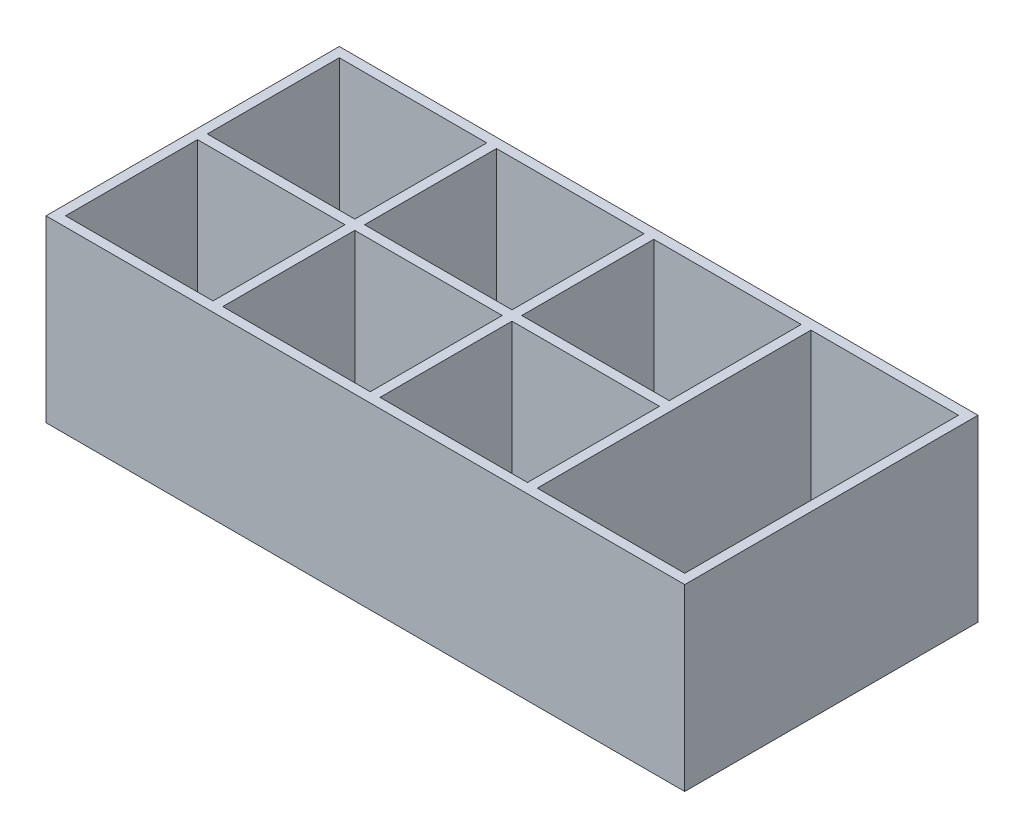
ISO-10303-21;
HEADER;
FILE_DESCRIPTION(('STEP AP214'),'2;1');
FILE_NAME('part.step','',(''),(''),'','','');
FILE_SCHEMA(('AUTOMOTIVE_DESIGN { 1 0 10303 214 1 1 1 1 }'));
ENDSEC;
DATA;
#1=APPLICATION_CONTEXT('core data for automotive mechanical design processes');
#2=APPLICATION_PROTOCOL_DEFINITION('international standard','automotive_design',2000,#1);
#3=PRODUCT_CONTEXT('',#1,'mechanical');
#4=PRODUCT('Part','Part','',(#3));
#5=PRODUCT_RELATED_PRODUCT_CATEGORY('part','',(#4));
#6=PRODUCT_DEFINITION_FORMATION('','',#4);
#7=PRODUCT_DEFINITION_CONTEXT('part definition',#1,'design');
#8=PRODUCT_DEFINITION('design','',#6,#7);
#9=PRODUCT_DEFINITION_SHAPE('','',#8);
#10=(LENGTH_UNIT() NAMED_UNIT(*) SI_UNIT(.MILLI.,.METRE.));
#11=(NAMED_UNIT(*) PLANE_ANGLE_UNIT() SI_UNIT($,.RADIAN.));
#12=(NAMED_UNIT(*) SI_UNIT($,.STERADIAN.) SOLID_ANGLE_UNIT());
#13=UNCERTAINTY_MEASURE_WITH_UNIT(LENGTH_MEASURE(1.E-05),#10,'distance_accuracy_value','');
#14=(GEOMETRIC_REPRESENTATION_CONTEXT(3) GLOBAL_UNCERTAINTY_ASSIGNED_CONTEXT((#13)) GLOBAL_UNIT_ASSIGNED_CONTEXT((#10,
#11,#12)) REPRESENTATION_CONTEXT('',''));
#15=CARTESIAN_POINT('',(0.,0.,0.));
#16=DIRECTION('',(0.,0.,1.));
#17=DIRECTION('',(1.,0.,0.));
#18=AXIS2_PLACEMENT_3D('',#15,#16,#17);
#19=CARTESIAN_POINT('',(98.,55.,45.));
#20=DIRECTION('',(-1.,0.,0.));
#21=DIRECTION('',(0.,0.,1.));
#22=AXIS2_PLACEMENT_3D('',#19,#20,#21);
#23=PLANE('',#22);
#24=DIRECTION('',(0.,0.,-1.));
#25=VECTOR('',#24,1.);
#26=CARTESIAN_POINT('',(98.,0.,45.));
#27=LINE('',#26,#25);
#28=CARTESIAN_POINT('',(98.,0.,45.));
#29=VERTEX_POINT('',#28);
#30=CARTESIAN_POINT('',(98.,0.,-45.));
#31=VERTEX_POINT('',#30);
#32=EDGE_CURVE('E463',#29,#31,#27,.T.);
#33=ORIENTED_EDGE('',*,*,#32,.T.);
#34=DIRECTION('',(0.,-1.,0.));
#35=VECTOR('',#34,1.);
#36=CARTESIAN_POINT('',(98.,55.,-45.));
#37=LINE('',#36,#35);
#38=CARTESIAN_POINT('',(98.,55.,-45.));
#39=VERTEX_POINT('',#38);
#40=EDGE_CURVE('E11',#39,#31,#37,.T.);
#41=ORIENTED_EDGE('',*,*,#40,.F.);
#42=DIRECTION('',(0.,0.,-1.));
#43=VECTOR('',#42,1.);
#44=CARTESIAN_POINT('',(98.,55.,45.));
#45=LINE('',#44,#43);
#46=CARTESIAN_POINT('',(98.,55.,45.));
#47=VERTEX_POINT('',#46);
#48=EDGE_CURVE('E470',#47,#39,#45,.T.);
#49=ORIENTED_EDGE('',*,*,#48,.F.);
#50=DIRECTION('',(0.,-1.,0.));
#51=VECTOR('',#50,1.);
#52=CARTESIAN_POINT('',(98.,55.,45.));
#53=LINE('',#52,#51);
#54=EDGE_CURVE('E480',#47,#29,#53,.T.);
#55=ORIENTED_EDGE('',*,*,#54,.T.);
#56=EDGE_LOOP('',(#33,#41,#49,#55));
#57=FACE_BOUND('',#56,.T.);
#58=ADVANCED_FACE('F33',(#57),#23,.F.);
#59=CARTESIAN_POINT('',(-98.,55.,-45.));
#60=DIRECTION('',(0.,0.,1.));
#61=DIRECTION('',(1.,0.,0.));
#62=AXIS2_PLACEMENT_3D('',#59,#60,#61);
#63=PLANE('',#62);
#64=DIRECTION('',(-1.,0.,0.));
#65=VECTOR('',#64,1.);
#66=CARTESIAN_POINT('',(-98.,0.,-45.));
#67=LINE('',#66,#65);
#68=CARTESIAN_POINT('',(-98.,0.,-45.));
#69=VERTEX_POINT('',#68);
#70=EDGE_CURVE('E483',#31,#69,#67,.T.);
#71=ORIENTED_EDGE('',*,*,#70,.T.);
#72=DIRECTION('',(0.,-1.,0.));
#73=VECTOR('',#72,1.);
#74=CARTESIAN_POINT('',(-98.,55.,-45.));
#75=LINE('',#74,#73);
#76=CARTESIAN_POINT('',(-98.,55.,-45.));
#77=VERTEX_POINT('',#76);
#78=EDGE_CURVE('E40',#77,#69,#75,.T.);
#79=ORIENTED_EDGE('',*,*,#78,.F.);
#80=DIRECTION('',(-1.,0.,0.));
#81=VECTOR('',#80,1.);
#82=CARTESIAN_POINT('',(-98.,55.,-45.));
#83=LINE('',#82,#81);
#84=EDGE_CURVE('E473',#39,#77,#83,.T.);
#85=ORIENTED_EDGE('',*,*,#84,.F.);
#86=ORIENTED_EDGE('',*,*,#40,.T.);
#87=EDGE_LOOP('',(#71,#79,#85,#86));
#88=FACE_BOUND('',#87,.T.);
#89=ADVANCED_FACE('F513',(#88),#63,.F.);
#90=CARTESIAN_POINT('',(-98.,55.,45.));
#91=DIRECTION('',(1.,0.,0.));
#92=DIRECTION('',(0.,0.,-1.));
#93=AXIS2_PLACEMENT_3D('',#90,#91,#92);
#94=PLANE('',#93);
#95=DIRECTION('',(0.,0.,1.));
#96=VECTOR('',#95,1.);
#97=CARTESIAN_POINT('',(-98.,0.,45.));
#98=LINE('',#97,#96);
#99=CARTESIAN_POINT('',(-98.,0.,45.));
#100=VERTEX_POINT('',#99);
#101=EDGE_CURVE('E485',#69,#100,#98,.T.);
#102=ORIENTED_EDGE('',*,*,#101,.T.);
#103=DIRECTION('',(0.,-1.,0.));
#104=VECTOR('',#103,1.);
#105=CARTESIAN_POINT('',(-98.,55.,45.));
#106=LINE('',#105,#104);
#107=CARTESIAN_POINT('',(-98.,55.,45.));
#108=VERTEX_POINT('',#107);
#109=EDGE_CURVE('E490',#108,#100,#106,.T.);
#110=ORIENTED_EDGE('',*,*,#109,.F.);
#111=DIRECTION('',(0.,0.,1.));
#112=VECTOR('',#111,1.);
#113=CARTESIAN_POINT('',(-98.,55.,45.));
#114=LINE('',#113,#112);
#115=EDGE_CURVE('E476',#77,#108,#114,.T.);
#116=ORIENTED_EDGE('',*,*,#115,.F.);
#117=ORIENTED_EDGE('',*,*,#78,.T.);
#118=EDGE_LOOP('',(#102,#110,#116,#117));
#119=FACE_BOUND('',#118,.T.);
#120=ADVANCED_FACE('F497',(#119),#94,.F.);
#121=CARTESIAN_POINT('',(-98.,55.,45.));
#122=DIRECTION('',(0.,0.,-1.));
#123=DIRECTION('',(-1.,0.,0.));
#124=AXIS2_PLACEMENT_3D('',#121,#122,#123);
#125=PLANE('',#124);
#126=DIRECTION('',(1.,0.,0.));
#127=VECTOR('',#126,1.);
#128=CARTESIAN_POINT('',(-98.,0.,45.));
#129=LINE('',#128,#127);
#130=EDGE_CURVE('E474',#100,#29,#129,.T.);
#131=ORIENTED_EDGE('',*,*,#130,.T.);
#132=ORIENTED_EDGE('',*,*,#54,.F.);
#133=DIRECTION('',(1.,0.,0.));
#134=VECTOR('',#133,1.);
#135=CARTESIAN_POINT('',(-98.,55.,45.));
#136=LINE('',#135,#134);
#137=EDGE_CURVE('E478',#108,#47,#136,.T.);
#138=ORIENTED_EDGE('',*,*,#137,.F.);
#139=ORIENTED_EDGE('',*,*,#109,.T.);
#140=EDGE_LOOP('',(#131,#132,#138,#139));
#141=FACE_BOUND('',#140,.T.);
#142=ADVANCED_FACE('F506',(#141),#125,.F.);
#143=CARTESIAN_POINT('',(0.,55.,0.));
#144=DIRECTION('',(0.,-1.,0.));
#145=DIRECTION('',(0.,0.,-1.));
#146=AXIS2_PLACEMENT_3D('',#143,#144,#145);
#147=PLANE('',#146);
#148=DIRECTION('',(-1.,0.,0.));
#149=VECTOR('',#148,1.);
#150=CARTESIAN_POINT('',(49.75,55.,-42.));
#151=LINE('',#150,#149);
#152=CARTESIAN_POINT('',(95.,55.,-42.));
#153=VERTEX_POINT('',#152);
#154=CARTESIAN_POINT('',(49.75,55.,-42.));
#155=VERTEX_POINT('',#154);
#156=EDGE_CURVE('E270',#153,#155,#151,.T.);
#157=ORIENTED_EDGE('',*,*,#156,.F.);
#158=DIRECTION('',(0.,0.,-1.));
#159=VECTOR('',#158,1.);
#160=CARTESIAN_POINT('',(95.,55.,42.));
#161=LINE('',#160,#159);
#162=CARTESIAN_POINT('',(95.,55.,42.));
#163=VERTEX_POINT('',#162);
#164=EDGE_CURVE('E47',#163,#153,#161,.T.);
#165=ORIENTED_EDGE('',*,*,#164,.F.);
#166=DIRECTION('',(1.,0.,0.));
#167=VECTOR('',#166,1.);
#168=CARTESIAN_POINT('',(49.75,55.,42.));
#169=LINE('',#168,#167);
#170=CARTESIAN_POINT('',(49.75,55.,42.));
#171=VERTEX_POINT('',#170);
#172=EDGE_CURVE('E261',#171,#163,#169,.T.);
#173=ORIENTED_EDGE('',*,*,#172,.F.);
#174=DIRECTION('',(0.,0.,1.));
#175=VECTOR('',#174,1.);
#176=CARTESIAN_POINT('',(49.75,55.,42.));
#177=LINE('',#176,#175);
#178=EDGE_CURVE('E264',#155,#171,#177,.T.);
#179=ORIENTED_EDGE('',*,*,#178,.F.);
#180=EDGE_LOOP('',(#157,#165,#173,#179));
#181=FACE_BOUND('',#180,.T.);
#182=DIRECTION('',(1.,0.,0.));
#183=VECTOR('',#182,1.);
#184=CARTESIAN_POINT('',(46.75,55.,42.));
#185=LINE('',#184,#183);
#186=CARTESIAN_POINT('',(1.50000000000001,55.,42.));
#187=VERTEX_POINT('',#186);
#188=CARTESIAN_POINT('',(46.75,55.,42.));
#189=VERTEX_POINT('',#188);
#190=EDGE_CURVE('E294',#187,#189,#185,.T.);
#191=ORIENTED_EDGE('',*,*,#190,.F.);
#192=DIRECTION('',(0.,0.,1.));
#193=VECTOR('',#192,1.);
#194=CARTESIAN_POINT('',(1.5,55.,1.49999999999999));
#195=LINE('',#194,#193);
#196=CARTESIAN_POINT('',(1.5,55.,1.49999999999999));
#197=VERTEX_POINT('',#196);
#198=EDGE_CURVE('E55',#197,#187,#195,.T.);
#199=ORIENTED_EDGE('',*,*,#198,.F.);
#200=DIRECTION('',(-1.,0.,0.));
#201=VECTOR('',#200,1.);
#202=CARTESIAN_POINT('',(46.75,55.,1.49999999999999));
#203=LINE('',#202,#201);
#204=CARTESIAN_POINT('',(46.75,55.,1.49999999999999));
#205=VERTEX_POINT('',#204);
#206=EDGE_CURVE('E283',#205,#197,#203,.T.);
#207=ORIENTED_EDGE('',*,*,#206,.F.);
#208=DIRECTION('',(0.,0.,-1.));
#209=VECTOR('',#208,1.);
#210=CARTESIAN_POINT('',(46.75,55.,1.49999999999999));
#211=LINE('',#210,#209);
#212=EDGE_CURVE('E297',#189,#205,#211,.T.);
#213=ORIENTED_EDGE('',*,*,#212,.F.);
#214=EDGE_LOOP('',(#191,#199,#207,#213));
#215=FACE_BOUND('',#214,.T.);
#216=DIRECTION('',(-1.,0.,0.));
#217=VECTOR('',#216,1.);
#218=CARTESIAN_POINT('',(1.49999999999999,55.,-42.));
#219=LINE('',#218,#217);
#220=CARTESIAN_POINT('',(46.75,55.,-42.));
#221=VERTEX_POINT('',#220);
#222=CARTESIAN_POINT('',(1.49999999999999,55.,-42.));
#223=VERTEX_POINT('',#222);
#224=EDGE_CURVE('E325',#221,#223,#219,.T.);
#225=ORIENTED_EDGE('',*,*,#224,.F.);
#226=DIRECTION('',(0.,0.,-1.));
#227=VECTOR('',#226,1.);
#228=CARTESIAN_POINT('',(46.75,55.,-42.));
#229=LINE('',#228,#227);
#230=CARTESIAN_POINT('',(46.75,55.,-1.5));
#231=VERTEX_POINT('',#230);
#232=EDGE_CURVE('E304',#231,#221,#229,.T.);
#233=ORIENTED_EDGE('',*,*,#232,.F.);
#234=DIRECTION('',(1.,0.,0.));
#235=VECTOR('',#234,1.);
#236=CARTESIAN_POINT('',(1.5,55.,-1.5));
#237=LINE('',#236,#235);
#238=CARTESIAN_POINT('',(1.5,55.,-1.5));
#239=VERTEX_POINT('',#238);
#240=EDGE_CURVE('E314',#239,#231,#237,.T.);
#241=ORIENTED_EDGE('',*,*,#240,.F.);
#242=DIRECTION('',(0.,0.,1.));
#243=VECTOR('',#242,1.);
#244=CARTESIAN_POINT('',(1.49999999999999,55.,-42.));
#245=LINE('',#244,#243);
#246=EDGE_CURVE('E328',#223,#239,#245,.T.);
#247=ORIENTED_EDGE('',*,*,#246,.F.);
#248=EDGE_LOOP('',(#225,#233,#241,#247));
#249=FACE_BOUND('',#248,.T.);
#250=DIRECTION('',(-1.,0.,0.));
#251=VECTOR('',#250,1.);
#252=CARTESIAN_POINT('',(-46.75,55.,1.49999999999999));
#253=LINE('',#252,#251);
#254=CARTESIAN_POINT('',(-1.5,55.,1.49999999999999));
#255=VERTEX_POINT('',#254);
#256=CARTESIAN_POINT('',(-46.75,55.,1.49999999999999));
#257=VERTEX_POINT('',#256);
#258=EDGE_CURVE('E357',#255,#257,#253,.T.);
#259=ORIENTED_EDGE('',*,*,#258,.F.);
#260=DIRECTION('',(0.,0.,-1.));
#261=VECTOR('',#260,1.);
#262=CARTESIAN_POINT('',(-1.5,55.,1.49999999999999));
#263=LINE('',#262,#261);
#264=CARTESIAN_POINT('',(-1.49999999999999,55.,42.));
#265=VERTEX_POINT('',#264);
#266=EDGE_CURVE('E335',#265,#255,#263,.T.);
#267=ORIENTED_EDGE('',*,*,#266,.F.);
#268=DIRECTION('',(1.,0.,0.));
#269=VECTOR('',#268,1.);
#270=CARTESIAN_POINT('',(-46.75,55.,42.));
#271=LINE('',#270,#269);
#272=CARTESIAN_POINT('',(-46.75,55.,42.));
#273=VERTEX_POINT('',#272);
#274=EDGE_CURVE('E346',#273,#265,#271,.T.);
#275=ORIENTED_EDGE('',*,*,#274,.F.);
#276=DIRECTION('',(0.,0.,1.));
#277=VECTOR('',#276,1.);
#278=CARTESIAN_POINT('',(-46.75,55.,1.49999999999999));
#279=LINE('',#278,#277);
#280=EDGE_CURVE('E360',#257,#273,#279,.T.);
#281=ORIENTED_EDGE('',*,*,#280,.F.);
#282=EDGE_LOOP('',(#259,#267,#275,#281));
#283=FACE_BOUND('',#282,.T.);
#284=DIRECTION('',(-1.,0.,0.));
#285=VECTOR('',#284,1.);
#286=CARTESIAN_POINT('',(-46.75,55.,-42.));
#287=LINE('',#286,#285);
#288=CARTESIAN_POINT('',(-1.5,55.,-42.));
#289=VERTEX_POINT('',#288);
#290=CARTESIAN_POINT('',(-46.75,55.,-42.));
#291=VERTEX_POINT('',#290);
#292=EDGE_CURVE('E389',#289,#291,#287,.T.);
#293=ORIENTED_EDGE('',*,*,#292,.F.);
#294=DIRECTION('',(0.,0.,-1.));
#295=VECTOR('',#294,1.);
#296=CARTESIAN_POINT('',(-1.5,55.,-42.));
#297=LINE('',#296,#295);
#298=CARTESIAN_POINT('',(-1.5,55.,-1.5));
#299=VERTEX_POINT('',#298);
#300=EDGE_CURVE('E367',#299,#289,#297,.T.);
#301=ORIENTED_EDGE('',*,*,#300,.F.);
#302=DIRECTION('',(1.,0.,0.));
#303=VECTOR('',#302,1.);
#304=CARTESIAN_POINT('',(-46.75,55.,-1.5));
#305=LINE('',#304,#303);
#306=CARTESIAN_POINT('',(-46.75,55.,-1.5));
#307=VERTEX_POINT('',#306);
#308=EDGE_CURVE('E378',#307,#299,#305,.T.);
#309=ORIENTED_EDGE('',*,*,#308,.F.);
#310=DIRECTION('',(0.,0.,1.));
#311=VECTOR('',#310,1.);
#312=CARTESIAN_POINT('',(-46.75,55.,-42.));
#313=LINE('',#312,#311);
#314=EDGE_CURVE('E392',#291,#307,#313,.T.);
#315=ORIENTED_EDGE('',*,*,#314,.F.);
#316=EDGE_LOOP('',(#293,#301,#309,#315));
#317=FACE_BOUND('',#316,.T.);
#318=DIRECTION('',(-1.,0.,0.));
#319=VECTOR('',#318,1.);
#320=CARTESIAN_POINT('',(-95.,55.,1.49999999999999));
#321=LINE('',#320,#319);
#322=CARTESIAN_POINT('',(-49.75,55.,1.49999999999999));
#323=VERTEX_POINT('',#322);
#324=CARTESIAN_POINT('',(-95.,55.,1.49999999999999));
#325=VERTEX_POINT('',#324);
#326=EDGE_CURVE('E421',#323,#325,#321,.T.);
#327=ORIENTED_EDGE('',*,*,#326,.F.);
#328=DIRECTION('',(0.,0.,-1.));
#329=VECTOR('',#328,1.);
#330=CARTESIAN_POINT('',(-49.75,55.,1.49999999999999));
#331=LINE('',#330,#329);
#332=CARTESIAN_POINT('',(-49.75,55.,42.));
#333=VERTEX_POINT('',#332);
#334=EDGE_CURVE('E399',#333,#323,#331,.T.);
#335=ORIENTED_EDGE('',*,*,#334,.F.);
#336=DIRECTION('',(1.,0.,0.));
#337=VECTOR('',#336,1.);
#338=CARTESIAN_POINT('',(-95.,55.,42.));
#339=LINE('',#338,#337);
#340=CARTESIAN_POINT('',(-95.,55.,42.));
#341=VERTEX_POINT('',#340);
#342=EDGE_CURVE('E410',#341,#333,#339,.T.);
#343=ORIENTED_EDGE('',*,*,#342,.F.);
#344=DIRECTION('',(0.,0.,1.));
#345=VECTOR('',#344,1.);
#346=CARTESIAN_POINT('',(-95.,55.,1.49999999999999));
#347=LINE('',#346,#345);
#348=EDGE_CURVE('E424',#325,#341,#347,.T.);
#349=ORIENTED_EDGE('',*,*,#348,.F.);
#350=EDGE_LOOP('',(#327,#335,#343,#349));
#351=FACE_BOUND('',#350,.T.);
#352=DIRECTION('',(-1.,0.,0.));
#353=VECTOR('',#352,1.);
#354=CARTESIAN_POINT('',(-95.,55.,-42.));
#355=LINE('',#354,#353);
#356=CARTESIAN_POINT('',(-49.75,55.,-42.));
#357=VERTEX_POINT('',#356);
#358=CARTESIAN_POINT('',(-95.,55.,-42.));
#359=VERTEX_POINT('',#358);
#360=EDGE_CURVE('E453',#357,#359,#355,.T.);
#361=ORIENTED_EDGE('',*,*,#360,.F.);
#362=DIRECTION('',(0.,0.,-1.));
#363=VECTOR('',#362,1.);
#364=CARTESIAN_POINT('',(-49.75,55.,-42.));
#365=LINE('',#364,#363);
#366=CARTESIAN_POINT('',(-49.75,55.,-1.5));
#367=VERTEX_POINT('',#366);
#368=EDGE_CURVE('E431',#367,#357,#365,.T.);
#369=ORIENTED_EDGE('',*,*,#368,.F.);
#370=DIRECTION('',(1.,0.,0.));
#371=VECTOR('',#370,1.);
#372=CARTESIAN_POINT('',(-95.,55.,-1.5));
#373=LINE('',#372,#371);
#374=CARTESIAN_POINT('',(-95.,55.,-1.5));
#375=VERTEX_POINT('',#374);
#376=EDGE_CURVE('E442',#375,#367,#373,.T.);
#377=ORIENTED_EDGE('',*,*,#376,.F.);
#378=DIRECTION('',(0.,0.,1.));
#379=VECTOR('',#378,1.);
#380=CARTESIAN_POINT('',(-95.,55.,-42.));
#381=LINE('',#380,#379);
#382=EDGE_CURVE('E456',#359,#375,#381,.T.);
#383=ORIENTED_EDGE('',*,*,#382,.F.);
#384=EDGE_LOOP('',(#361,#369,#377,#383));
#385=FACE_BOUND('',#384,.T.);
#386=ORIENTED_EDGE('',*,*,#48,.T.);
#387=ORIENTED_EDGE('',*,*,#84,.T.);
#388=ORIENTED_EDGE('',*,*,#115,.T.);
#389=ORIENTED_EDGE('',*,*,#137,.T.);
#390=EDGE_LOOP('',(#386,#387,#388,#389));
#391=FACE_BOUND('',#390,.T.);
#392=ADVANCED_FACE('F512',(#181,#215,#249,#283,#317,#351,#385,#391),#147,.F.);
#393=CARTESIAN_POINT('',(0.,0.,0.));
#394=DIRECTION('',(0.,-1.,0.));
#395=DIRECTION('',(0.,0.,-1.));
#396=AXIS2_PLACEMENT_3D('',#393,#394,#395);
#397=PLANE('',#396);
#398=ORIENTED_EDGE('',*,*,#32,.F.);
#399=ORIENTED_EDGE('',*,*,#130,.F.);
#400=ORIENTED_EDGE('',*,*,#101,.F.);
#401=ORIENTED_EDGE('',*,*,#70,.F.);
#402=EDGE_LOOP('',(#398,#399,#400,#401));
#403=FACE_BOUND('',#402,.T.);
#404=ADVANCED_FACE('F503',(#403),#397,.T.);
#405=CARTESIAN_POINT('',(-49.75,3.,-42.));
#406=DIRECTION('',(1.,0.,0.));
#407=DIRECTION('',(0.,0.,-1.));
#408=AXIS2_PLACEMENT_3D('',#405,#406,#407);
#409=PLANE('',#408);
#410=ORIENTED_EDGE('',*,*,#368,.T.);
#411=DIRECTION('',(0.,1.,0.));
#412=VECTOR('',#411,1.);
#413=CARTESIAN_POINT('',(-49.75,3.,-42.));
#414=LINE('',#413,#412);
#415=CARTESIAN_POINT('',(-49.75,3.,-42.));
#416=VERTEX_POINT('',#415);
#417=EDGE_CURVE('E451',#416,#357,#414,.T.);
#418=ORIENTED_EDGE('',*,*,#417,.F.);
#419=DIRECTION('',(0.,0.,-1.));
#420=VECTOR('',#419,1.);
#421=CARTESIAN_POINT('',(-49.75,3.,-42.));
#422=LINE('',#421,#420);
#423=CARTESIAN_POINT('',(-49.75,3.,-1.5));
#424=VERTEX_POINT('',#423);
#425=EDGE_CURVE('E438',#424,#416,#422,.T.);
#426=ORIENTED_EDGE('',*,*,#425,.F.);
#427=DIRECTION('',(0.,1.,0.));
#428=VECTOR('',#427,1.);
#429=CARTESIAN_POINT('',(-49.75,3.,-1.5));
#430=LINE('',#429,#428);
#431=EDGE_CURVE('E461',#424,#367,#430,.T.);
#432=ORIENTED_EDGE('',*,*,#431,.T.);
#433=EDGE_LOOP('',(#410,#418,#426,#432));
#434=FACE_BOUND('',#433,.T.);
#435=ADVANCED_FACE('F525',(#434),#409,.F.);
#436=CARTESIAN_POINT('',(-95.,3.,-1.5));
#437=DIRECTION('',(0.,0.,1.));
#438=DIRECTION('',(1.,0.,0.));
#439=AXIS2_PLACEMENT_3D('',#436,#437,#438);
#440=PLANE('',#439);
#441=ORIENTED_EDGE('',*,*,#376,.T.);
#442=ORIENTED_EDGE('',*,*,#431,.F.);
#443=DIRECTION('',(1.,0.,0.));
#444=VECTOR('',#443,1.);
#445=CARTESIAN_POINT('',(-95.,3.,-1.5));
#446=LINE('',#445,#444);
#447=CARTESIAN_POINT('',(-95.,3.,-1.5));
#448=VERTEX_POINT('',#447);
#449=EDGE_CURVE('E448',#448,#424,#446,.T.);
#450=ORIENTED_EDGE('',*,*,#449,.F.);
#451=DIRECTION('',(0.,1.,0.));
#452=VECTOR('',#451,1.);
#453=CARTESIAN_POINT('',(-95.,3.,-1.5));
#454=LINE('',#453,#452);
#455=EDGE_CURVE('E464',#448,#375,#454,.T.);
#456=ORIENTED_EDGE('',*,*,#455,.T.);
#457=EDGE_LOOP('',(#441,#442,#450,#456));
#458=FACE_BOUND('',#457,.T.);
#459=ADVANCED_FACE('F531',(#458),#440,.F.);
#460=CARTESIAN_POINT('',(-95.,3.,-42.));
#461=DIRECTION('',(-1.,0.,0.));
#462=DIRECTION('',(0.,0.,1.));
#463=AXIS2_PLACEMENT_3D('',#460,#461,#462);
#464=PLANE('',#463);
#465=ORIENTED_EDGE('',*,*,#382,.T.);
#466=ORIENTED_EDGE('',*,*,#455,.F.);
#467=DIRECTION('',(0.,0.,1.));
#468=VECTOR('',#467,1.);
#469=CARTESIAN_POINT('',(-95.,3.,-42.));
#470=LINE('',#469,#468);
#471=CARTESIAN_POINT('',(-95.,3.,-42.));
#472=VERTEX_POINT('',#471);
#473=EDGE_CURVE('E445',#472,#448,#470,.T.);
#474=ORIENTED_EDGE('',*,*,#473,.F.);
#475=DIRECTION('',(0.,1.,0.));
#476=VECTOR('',#475,1.);
#477=CARTESIAN_POINT('',(-95.,3.,-42.));
#478=LINE('',#477,#476);
#479=EDGE_CURVE('E466',#472,#359,#478,.T.);
#480=ORIENTED_EDGE('',*,*,#479,.T.);
#481=EDGE_LOOP('',(#465,#466,#474,#480));
#482=FACE_BOUND('',#481,.T.);
#483=ADVANCED_FACE('F537',(#482),#464,.F.);
#484=CARTESIAN_POINT('',(-95.,3.,-42.));
#485=DIRECTION('',(0.,0.,-1.));
#486=DIRECTION('',(-1.,0.,0.));
#487=AXIS2_PLACEMENT_3D('',#484,#485,#486);
#488=PLANE('',#487);
#489=ORIENTED_EDGE('',*,*,#360,.T.);
#490=ORIENTED_EDGE('',*,*,#479,.F.);
#491=DIRECTION('',(-1.,0.,0.));
#492=VECTOR('',#491,1.);
#493=CARTESIAN_POINT('',(-95.,3.,-42.));
#494=LINE('',#493,#492);
#495=EDGE_CURVE('E441',#416,#472,#494,.T.);
#496=ORIENTED_EDGE('',*,*,#495,.F.);
#497=ORIENTED_EDGE('',*,*,#417,.T.);
#498=EDGE_LOOP('',(#489,#490,#496,#497));
#499=FACE_BOUND('',#498,.T.);
#500=ADVANCED_FACE('F533',(#499),#488,.F.);
#501=CARTESIAN_POINT('',(0.,3.,0.));
#502=DIRECTION('',(0.,1.,0.));
#503=DIRECTION('',(0.,0.,1.));
#504=AXIS2_PLACEMENT_3D('',#501,#502,#503);
#505=PLANE('',#504);
#506=ORIENTED_EDGE('',*,*,#425,.T.);
#507=ORIENTED_EDGE('',*,*,#495,.T.);
#508=ORIENTED_EDGE('',*,*,#473,.T.);
#509=ORIENTED_EDGE('',*,*,#449,.T.);
#510=EDGE_LOOP('',(#506,#507,#508,#509));
#511=FACE_BOUND('',#510,.T.);
#512=ADVANCED_FACE('F536',(#511),#505,.T.);
#513=CARTESIAN_POINT('',(-49.75,3.,1.49999999999999));
#514=DIRECTION('',(1.,0.,0.));
#515=DIRECTION('',(0.,0.,-1.));
#516=AXIS2_PLACEMENT_3D('',#513,#514,#515);
#517=PLANE('',#516);
#518=ORIENTED_EDGE('',*,*,#334,.T.);
#519=DIRECTION('',(0.,1.,0.));
#520=VECTOR('',#519,1.);
#521=CARTESIAN_POINT('',(-49.75,3.,1.49999999999999));
#522=LINE('',#521,#520);
#523=CARTESIAN_POINT('',(-49.75,3.,1.49999999999999));
#524=VERTEX_POINT('',#523);
#525=EDGE_CURVE('E419',#524,#323,#522,.T.);
#526=ORIENTED_EDGE('',*,*,#525,.F.);
#527=DIRECTION('',(0.,0.,-1.));
#528=VECTOR('',#527,1.);
#529=CARTESIAN_POINT('',(-49.75,3.,1.49999999999999));
#530=LINE('',#529,#528);
#531=CARTESIAN_POINT('',(-49.75,3.,42.));
#532=VERTEX_POINT('',#531);
#533=EDGE_CURVE('E406',#532,#524,#530,.T.);
#534=ORIENTED_EDGE('',*,*,#533,.F.);
#535=DIRECTION('',(0.,1.,0.));
#536=VECTOR('',#535,1.);
#537=CARTESIAN_POINT('',(-49.75,3.,42.));
#538=LINE('',#537,#536);
#539=EDGE_CURVE('E429',#532,#333,#538,.T.);
#540=ORIENTED_EDGE('',*,*,#539,.T.);
#541=EDGE_LOOP('',(#518,#526,#534,#540));
#542=FACE_BOUND('',#541,.T.);
#543=ADVANCED_FACE('F547',(#542),#517,.F.);
#544=CARTESIAN_POINT('',(-95.,3.,42.));
#545=DIRECTION('',(0.,0.,1.));
#546=DIRECTION('',(1.,0.,0.));
#547=AXIS2_PLACEMENT_3D('',#544,#545,#546);
#548=PLANE('',#547);
#549=ORIENTED_EDGE('',*,*,#342,.T.);
#550=ORIENTED_EDGE('',*,*,#539,.F.);
#551=DIRECTION('',(1.,0.,0.));
#552=VECTOR('',#551,1.);
#553=CARTESIAN_POINT('',(-95.,3.,42.));
#554=LINE('',#553,#552);
#555=CARTESIAN_POINT('',(-95.,3.,42.));
#556=VERTEX_POINT('',#555);
#557=EDGE_CURVE('E416',#556,#532,#554,.T.);
#558=ORIENTED_EDGE('',*,*,#557,.F.);
#559=DIRECTION('',(0.,1.,0.));
#560=VECTOR('',#559,1.);
#561=CARTESIAN_POINT('',(-95.,3.,42.));
#562=LINE('',#561,#560);
#563=EDGE_CURVE('E432',#556,#341,#562,.T.);
#564=ORIENTED_EDGE('',*,*,#563,.T.);
#565=EDGE_LOOP('',(#549,#550,#558,#564));
#566=FACE_BOUND('',#565,.T.);
#567=ADVANCED_FACE('F551',(#566),#548,.F.);
#568=CARTESIAN_POINT('',(-95.,3.,1.49999999999999));
#569=DIRECTION('',(-1.,0.,0.));
#570=DIRECTION('',(0.,0.,1.));
#571=AXIS2_PLACEMENT_3D('',#568,#569,#570);
#572=PLANE('',#571);
#573=ORIENTED_EDGE('',*,*,#348,.T.);
#574=ORIENTED_EDGE('',*,*,#563,.F.);
#575=DIRECTION('',(0.,0.,1.));
#576=VECTOR('',#575,1.);
#577=CARTESIAN_POINT('',(-95.,3.,1.49999999999999));
#578=LINE('',#577,#576);
#579=CARTESIAN_POINT('',(-95.,3.,1.49999999999999));
#580=VERTEX_POINT('',#579);
#581=EDGE_CURVE('E413',#580,#556,#578,.T.);
#582=ORIENTED_EDGE('',*,*,#581,.F.);
#583=DIRECTION('',(0.,1.,0.));
#584=VECTOR('',#583,1.);
#585=CARTESIAN_POINT('',(-95.,3.,1.49999999999999));
#586=LINE('',#585,#584);
#587=EDGE_CURVE('E434',#580,#325,#586,.T.);
#588=ORIENTED_EDGE('',*,*,#587,.T.);
#589=EDGE_LOOP('',(#573,#574,#582,#588));
#590=FACE_BOUND('',#589,.T.);
#591=ADVANCED_FACE('F557',(#590),#572,.F.);
#592=CARTESIAN_POINT('',(-95.,3.,1.49999999999999));
#593=DIRECTION('',(0.,0.,-1.));
#594=DIRECTION('',(-1.,0.,0.));
#595=AXIS2_PLACEMENT_3D('',#592,#593,#594);
#596=PLANE('',#595);
#597=ORIENTED_EDGE('',*,*,#326,.T.);
#598=ORIENTED_EDGE('',*,*,#587,.F.);
#599=DIRECTION('',(-1.,0.,0.));
#600=VECTOR('',#599,1.);
#601=CARTESIAN_POINT('',(-95.,3.,1.49999999999999));
#602=LINE('',#601,#600);
#603=EDGE_CURVE('E409',#524,#580,#602,.T.);
#604=ORIENTED_EDGE('',*,*,#603,.F.);
#605=ORIENTED_EDGE('',*,*,#525,.T.);
#606=EDGE_LOOP('',(#597,#598,#604,#605));
#607=FACE_BOUND('',#606,.T.);
#608=ADVANCED_FACE('F553',(#607),#596,.F.);
#609=CARTESIAN_POINT('',(0.,3.,0.));
#610=DIRECTION('',(0.,1.,0.));
#611=DIRECTION('',(0.,0.,1.));
#612=AXIS2_PLACEMENT_3D('',#609,#610,#611);
#613=PLANE('',#612);
#614=ORIENTED_EDGE('',*,*,#533,.T.);
#615=ORIENTED_EDGE('',*,*,#603,.T.);
#616=ORIENTED_EDGE('',*,*,#581,.T.);
#617=ORIENTED_EDGE('',*,*,#557,.T.);
#618=EDGE_LOOP('',(#614,#615,#616,#617));
#619=FACE_BOUND('',#618,.T.);
#620=ADVANCED_FACE('F556',(#619),#613,.T.);
#621=CARTESIAN_POINT('',(-1.5,3.,-42.));
#622=DIRECTION('',(1.,0.,0.));
#623=DIRECTION('',(0.,0.,-1.));
#624=AXIS2_PLACEMENT_3D('',#621,#622,#623);
#625=PLANE('',#624);
#626=ORIENTED_EDGE('',*,*,#300,.T.);
#627=DIRECTION('',(0.,1.,0.));
#628=VECTOR('',#627,1.);
#629=CARTESIAN_POINT('',(-1.5,3.,-42.));
#630=LINE('',#629,#628);
#631=CARTESIAN_POINT('',(-1.5,3.,-42.));
#632=VERTEX_POINT('',#631);
#633=EDGE_CURVE('E387',#632,#289,#630,.T.);
#634=ORIENTED_EDGE('',*,*,#633,.F.);
#635=DIRECTION('',(0.,0.,-1.));
#636=VECTOR('',#635,1.);
#637=CARTESIAN_POINT('',(-1.5,3.,-42.));
#638=LINE('',#637,#636);
#639=CARTESIAN_POINT('',(-1.5,3.,-1.5));
#640=VERTEX_POINT('',#639);
#641=EDGE_CURVE('E374',#640,#632,#638,.T.);
#642=ORIENTED_EDGE('',*,*,#641,.F.);
#643=DIRECTION('',(0.,1.,0.));
#644=VECTOR('',#643,1.);
#645=CARTESIAN_POINT('',(-1.5,3.,-1.5));
#646=LINE('',#645,#644);
#647=EDGE_CURVE('E397',#640,#299,#646,.T.);
#648=ORIENTED_EDGE('',*,*,#647,.T.);
#649=EDGE_LOOP('',(#626,#634,#642,#648));
#650=FACE_BOUND('',#649,.T.);
#651=ADVANCED_FACE('F567',(#650),#625,.F.);
#652=CARTESIAN_POINT('',(-46.75,3.,-1.5));
#653=DIRECTION('',(0.,0.,1.));
#654=DIRECTION('',(1.,0.,0.));
#655=AXIS2_PLACEMENT_3D('',#652,#653,#654);
#656=PLANE('',#655);
#657=ORIENTED_EDGE('',*,*,#308,.T.);
#658=ORIENTED_EDGE('',*,*,#647,.F.);
#659=DIRECTION('',(1.,0.,0.));
#660=VECTOR('',#659,1.);
#661=CARTESIAN_POINT('',(-46.75,3.,-1.5));
#662=LINE('',#661,#660);
#663=CARTESIAN_POINT('',(-46.75,3.,-1.5));
#664=VERTEX_POINT('',#663);
#665=EDGE_CURVE('E384',#664,#640,#662,.T.);
#666=ORIENTED_EDGE('',*,*,#665,.F.);
#667=DIRECTION('',(0.,1.,0.));
#668=VECTOR('',#667,1.);
#669=CARTESIAN_POINT('',(-46.75,3.,-1.5));
#670=LINE('',#669,#668);
#671=EDGE_CURVE('E400',#664,#307,#670,.T.);
#672=ORIENTED_EDGE('',*,*,#671,.T.);
#673=EDGE_LOOP('',(#657,#658,#666,#672));
#674=FACE_BOUND('',#673,.T.);
#675=ADVANCED_FACE('F571',(#674),#656,.F.);
#676=CARTESIAN_POINT('',(-46.75,3.,-42.));
#677=DIRECTION('',(-1.,0.,0.));
#678=DIRECTION('',(0.,0.,1.));
#679=AXIS2_PLACEMENT_3D('',#676,#677,#678);
#680=PLANE('',#679);
#681=ORIENTED_EDGE('',*,*,#314,.T.);
#682=ORIENTED_EDGE('',*,*,#671,.F.);
#683=DIRECTION('',(0.,0.,1.));
#684=VECTOR('',#683,1.);
#685=CARTESIAN_POINT('',(-46.75,3.,-42.));
#686=LINE('',#685,#684);
#687=CARTESIAN_POINT('',(-46.75,3.,-42.));
#688=VERTEX_POINT('',#687);
#689=EDGE_CURVE('E381',#688,#664,#686,.T.);
#690=ORIENTED_EDGE('',*,*,#689,.F.);
#691=DIRECTION('',(0.,1.,0.));
#692=VECTOR('',#691,1.);
#693=CARTESIAN_POINT('',(-46.75,3.,-42.));
#694=LINE('',#693,#692);
#695=EDGE_CURVE('E402',#688,#291,#694,.T.);
#696=ORIENTED_EDGE('',*,*,#695,.T.);
#697=EDGE_LOOP('',(#681,#682,#690,#696));
#698=FACE_BOUND('',#697,.T.);
#699=ADVANCED_FACE('F577',(#698),#680,.F.);
#700=CARTESIAN_POINT('',(-46.75,3.,-42.));
#701=DIRECTION('',(0.,0.,-1.));
#702=DIRECTION('',(-1.,0.,0.));
#703=AXIS2_PLACEMENT_3D('',#700,#701,#702);
#704=PLANE('',#703);
#705=ORIENTED_EDGE('',*,*,#292,.T.);
#706=ORIENTED_EDGE('',*,*,#695,.F.);
#707=DIRECTION('',(-1.,0.,0.));
#708=VECTOR('',#707,1.);
#709=CARTESIAN_POINT('',(-46.75,3.,-42.));
#710=LINE('',#709,#708);
#711=EDGE_CURVE('E377',#632,#688,#710,.T.);
#712=ORIENTED_EDGE('',*,*,#711,.F.);
#713=ORIENTED_EDGE('',*,*,#633,.T.);
#714=EDGE_LOOP('',(#705,#706,#712,#713));
#715=FACE_BOUND('',#714,.T.);
#716=ADVANCED_FACE('F573',(#715),#704,.F.);
#717=CARTESIAN_POINT('',(0.,3.,0.));
#718=DIRECTION('',(0.,1.,0.));
#719=DIRECTION('',(0.,0.,1.));
#720=AXIS2_PLACEMENT_3D('',#717,#718,#719);
#721=PLANE('',#720);
#722=ORIENTED_EDGE('',*,*,#641,.T.);
#723=ORIENTED_EDGE('',*,*,#711,.T.);
#724=ORIENTED_EDGE('',*,*,#689,.T.);
#725=ORIENTED_EDGE('',*,*,#665,.T.);
#726=EDGE_LOOP('',(#722,#723,#724,#725));
#727=FACE_BOUND('',#726,.T.);
#728=ADVANCED_FACE('F576',(#727),#721,.T.);
#729=CARTESIAN_POINT('',(-1.5,3.,1.49999999999999));
#730=DIRECTION('',(1.,0.,0.));
#731=DIRECTION('',(0.,0.,-1.));
#732=AXIS2_PLACEMENT_3D('',#729,#730,#731);
#733=PLANE('',#732);
#734=ORIENTED_EDGE('',*,*,#266,.T.);
#735=DIRECTION('',(0.,1.,0.));
#736=VECTOR('',#735,1.);
#737=CARTESIAN_POINT('',(-1.5,3.,1.49999999999999));
#738=LINE('',#737,#736);
#739=CARTESIAN_POINT('',(-1.5,3.,1.49999999999999));
#740=VERTEX_POINT('',#739);
#741=EDGE_CURVE('E355',#740,#255,#738,.T.);
#742=ORIENTED_EDGE('',*,*,#741,.F.);
#743=DIRECTION('',(0.,0.,-1.));
#744=VECTOR('',#743,1.);
#745=CARTESIAN_POINT('',(-1.5,3.,1.49999999999999));
#746=LINE('',#745,#744);
#747=CARTESIAN_POINT('',(-1.49999999999999,3.,42.));
#748=VERTEX_POINT('',#747);
#749=EDGE_CURVE('E342',#748,#740,#746,.T.);
#750=ORIENTED_EDGE('',*,*,#749,.F.);
#751=DIRECTION('',(0.,1.,0.));
#752=VECTOR('',#751,1.);
#753=CARTESIAN_POINT('',(-1.49999999999999,3.,42.));
#754=LINE('',#753,#752);
#755=EDGE_CURVE('E365',#748,#265,#754,.T.);
#756=ORIENTED_EDGE('',*,*,#755,.T.);
#757=EDGE_LOOP('',(#734,#742,#750,#756));
#758=FACE_BOUND('',#757,.T.);
#759=ADVANCED_FACE('F587',(#758),#733,.F.);
#760=CARTESIAN_POINT('',(-46.75,3.,42.));
#761=DIRECTION('',(0.,0.,1.));
#762=DIRECTION('',(1.,0.,0.));
#763=AXIS2_PLACEMENT_3D('',#760,#761,#762);
#764=PLANE('',#763);
#765=ORIENTED_EDGE('',*,*,#274,.T.);
#766=ORIENTED_EDGE('',*,*,#755,.F.);
#767=DIRECTION('',(1.,0.,0.));
#768=VECTOR('',#767,1.);
#769=CARTESIAN_POINT('',(-46.75,3.,42.));
#770=LINE('',#769,#768);
#771=CARTESIAN_POINT('',(-46.75,3.,42.));
#772=VERTEX_POINT('',#771);
#773=EDGE_CURVE('E352',#772,#748,#770,.T.);
#774=ORIENTED_EDGE('',*,*,#773,.F.);
#775=DIRECTION('',(0.,1.,0.));
#776=VECTOR('',#775,1.);
#777=CARTESIAN_POINT('',(-46.75,3.,42.));
#778=LINE('',#777,#776);
#779=EDGE_CURVE('E368',#772,#273,#778,.T.);
#780=ORIENTED_EDGE('',*,*,#779,.T.);
#781=EDGE_LOOP('',(#765,#766,#774,#780));
#782=FACE_BOUND('',#781,.T.);
#783=ADVANCED_FACE('F591',(#782),#764,.F.);
#784=CARTESIAN_POINT('',(-46.75,3.,1.49999999999999));
#785=DIRECTION('',(-1.,0.,0.));
#786=DIRECTION('',(0.,0.,1.));
#787=AXIS2_PLACEMENT_3D('',#784,#785,#786);
#788=PLANE('',#787);
#789=ORIENTED_EDGE('',*,*,#280,.T.);
#790=ORIENTED_EDGE('',*,*,#779,.F.);
#791=DIRECTION('',(0.,0.,1.));
#792=VECTOR('',#791,1.);
#793=CARTESIAN_POINT('',(-46.75,3.,1.49999999999999));
#794=LINE('',#793,#792);
#795=CARTESIAN_POINT('',(-46.75,3.,1.49999999999999));
#796=VERTEX_POINT('',#795);
#797=EDGE_CURVE('E349',#796,#772,#794,.T.);
#798=ORIENTED_EDGE('',*,*,#797,.F.);
#799=DIRECTION('',(0.,1.,0.));
#800=VECTOR('',#799,1.);
#801=CARTESIAN_POINT('',(-46.75,3.,1.49999999999999));
#802=LINE('',#801,#800);
#803=EDGE_CURVE('E370',#796,#257,#802,.T.);
#804=ORIENTED_EDGE('',*,*,#803,.T.);
#805=EDGE_LOOP('',(#789,#790,#798,#804));
#806=FACE_BOUND('',#805,.T.);
#807=ADVANCED_FACE('F597',(#806),#788,.F.);
#808=CARTESIAN_POINT('',(-46.75,3.,1.49999999999999));
#809=DIRECTION('',(0.,0.,-1.));
#810=DIRECTION('',(-1.,0.,0.));
#811=AXIS2_PLACEMENT_3D('',#808,#809,#810);
#812=PLANE('',#811);
#813=ORIENTED_EDGE('',*,*,#258,.T.);
#814=ORIENTED_EDGE('',*,*,#803,.F.);
#815=DIRECTION('',(-1.,0.,0.));
#816=VECTOR('',#815,1.);
#817=CARTESIAN_POINT('',(-46.75,3.,1.49999999999999));
#818=LINE('',#817,#816);
#819=EDGE_CURVE('E345',#740,#796,#818,.T.);
#820=ORIENTED_EDGE('',*,*,#819,.F.);
#821=ORIENTED_EDGE('',*,*,#741,.T.);
#822=EDGE_LOOP('',(#813,#814,#820,#821));
#823=FACE_BOUND('',#822,.T.);
#824=ADVANCED_FACE('F593',(#823),#812,.F.);
#825=CARTESIAN_POINT('',(0.,3.,0.));
#826=DIRECTION('',(0.,1.,0.));
#827=DIRECTION('',(0.,0.,1.));
#828=AXIS2_PLACEMENT_3D('',#825,#826,#827);
#829=PLANE('',#828);
#830=ORIENTED_EDGE('',*,*,#749,.T.);
#831=ORIENTED_EDGE('',*,*,#819,.T.);
#832=ORIENTED_EDGE('',*,*,#797,.T.);
#833=ORIENTED_EDGE('',*,*,#773,.T.);
#834=EDGE_LOOP('',(#830,#831,#832,#833));
#835=FACE_BOUND('',#834,.T.);
#836=ADVANCED_FACE('F596',(#835),#829,.T.);
#837=CARTESIAN_POINT('',(46.75,3.,-42.));
#838=DIRECTION('',(1.,0.,0.));
#839=DIRECTION('',(0.,0.,-1.));
#840=AXIS2_PLACEMENT_3D('',#837,#838,#839);
#841=PLANE('',#840);
#842=ORIENTED_EDGE('',*,*,#232,.T.);
#843=DIRECTION('',(0.,1.,0.));
#844=VECTOR('',#843,1.);
#845=CARTESIAN_POINT('',(46.75,3.,-42.));
#846=LINE('',#845,#844);
#847=CARTESIAN_POINT('',(46.75,3.,-42.));
#848=VERTEX_POINT('',#847);
#849=EDGE_CURVE('E323',#848,#221,#846,.T.);
#850=ORIENTED_EDGE('',*,*,#849,.F.);
#851=DIRECTION('',(0.,0.,-1.));
#852=VECTOR('',#851,1.);
#853=CARTESIAN_POINT('',(46.75,3.,-42.));
#854=LINE('',#853,#852);
#855=CARTESIAN_POINT('',(46.75,3.,-1.5));
#856=VERTEX_POINT('',#855);
#857=EDGE_CURVE('E310',#856,#848,#854,.T.);
#858=ORIENTED_EDGE('',*,*,#857,.F.);
#859=DIRECTION('',(0.,1.,0.));
#860=VECTOR('',#859,1.);
#861=CARTESIAN_POINT('',(46.75,3.,-1.5));
#862=LINE('',#861,#860);
#863=EDGE_CURVE('E333',#856,#231,#862,.T.);
#864=ORIENTED_EDGE('',*,*,#863,.T.);
#865=EDGE_LOOP('',(#842,#850,#858,#864));
#866=FACE_BOUND('',#865,.T.);
#867=ADVANCED_FACE('F607',(#866),#841,.F.);
#868=CARTESIAN_POINT('',(1.5,3.,-1.5));
#869=DIRECTION('',(0.,0.,1.));
#870=DIRECTION('',(1.,0.,0.));
#871=AXIS2_PLACEMENT_3D('',#868,#869,#870);
#872=PLANE('',#871);
#873=ORIENTED_EDGE('',*,*,#240,.T.);
#874=ORIENTED_EDGE('',*,*,#863,.F.);
#875=DIRECTION('',(1.,0.,0.));
#876=VECTOR('',#875,1.);
#877=CARTESIAN_POINT('',(1.5,3.,-1.5));
#878=LINE('',#877,#876);
#879=CARTESIAN_POINT('',(1.5,3.,-1.5));
#880=VERTEX_POINT('',#879);
#881=EDGE_CURVE('E320',#880,#856,#878,.T.);
#882=ORIENTED_EDGE('',*,*,#881,.F.);
#883=DIRECTION('',(0.,1.,0.));
#884=VECTOR('',#883,1.);
#885=CARTESIAN_POINT('',(1.5,3.,-1.5));
#886=LINE('',#885,#884);
#887=EDGE_CURVE('E336',#880,#239,#886,.T.);
#888=ORIENTED_EDGE('',*,*,#887,.T.);
#889=EDGE_LOOP('',(#873,#874,#882,#888));
#890=FACE_BOUND('',#889,.T.);
#891=ADVANCED_FACE('F611',(#890),#872,.F.);
#892=CARTESIAN_POINT('',(1.49999999999999,3.,-42.));
#893=DIRECTION('',(-1.,0.,0.));
#894=DIRECTION('',(0.,0.,1.));
#895=AXIS2_PLACEMENT_3D('',#892,#893,#894);
#896=PLANE('',#895);
#897=ORIENTED_EDGE('',*,*,#246,.T.);
#898=ORIENTED_EDGE('',*,*,#887,.F.);
#899=DIRECTION('',(0.,0.,1.));
#900=VECTOR('',#899,1.);
#901=CARTESIAN_POINT('',(1.49999999999999,3.,-42.));
#902=LINE('',#901,#900);
#903=CARTESIAN_POINT('',(1.49999999999999,3.,-42.));
#904=VERTEX_POINT('',#903);
#905=EDGE_CURVE('E317',#904,#880,#902,.T.);
#906=ORIENTED_EDGE('',*,*,#905,.F.);
#907=DIRECTION('',(0.,1.,0.));
#908=VECTOR('',#907,1.);
#909=CARTESIAN_POINT('',(1.49999999999999,3.,-42.));
#910=LINE('',#909,#908);
#911=EDGE_CURVE('E338',#904,#223,#910,.T.);
#912=ORIENTED_EDGE('',*,*,#911,.T.);
#913=EDGE_LOOP('',(#897,#898,#906,#912));
#914=FACE_BOUND('',#913,.T.);
#915=ADVANCED_FACE('F617',(#914),#896,.F.);
#916=CARTESIAN_POINT('',(1.49999999999999,3.,-42.));
#917=DIRECTION('',(0.,0.,-1.));
#918=DIRECTION('',(-1.,0.,0.));
#919=AXIS2_PLACEMENT_3D('',#916,#917,#918);
#920=PLANE('',#919);
#921=ORIENTED_EDGE('',*,*,#224,.T.);
#922=ORIENTED_EDGE('',*,*,#911,.F.);
#923=DIRECTION('',(-1.,0.,0.));
#924=VECTOR('',#923,1.);
#925=CARTESIAN_POINT('',(1.49999999999999,3.,-42.));
#926=LINE('',#925,#924);
#927=EDGE_CURVE('E313',#848,#904,#926,.T.);
#928=ORIENTED_EDGE('',*,*,#927,.F.);
#929=ORIENTED_EDGE('',*,*,#849,.T.);
#930=EDGE_LOOP('',(#921,#922,#928,#929));
#931=FACE_BOUND('',#930,.T.);
#932=ADVANCED_FACE('F613',(#931),#920,.F.);
#933=CARTESIAN_POINT('',(0.,3.,0.));
#934=DIRECTION('',(0.,1.,0.));
#935=DIRECTION('',(0.,0.,1.));
#936=AXIS2_PLACEMENT_3D('',#933,#934,#935);
#937=PLANE('',#936);
#938=ORIENTED_EDGE('',*,*,#857,.T.);
#939=ORIENTED_EDGE('',*,*,#927,.T.);
#940=ORIENTED_EDGE('',*,*,#905,.T.);
#941=ORIENTED_EDGE('',*,*,#881,.T.);
#942=EDGE_LOOP('',(#938,#939,#940,#941));
#943=FACE_BOUND('',#942,.T.);
#944=ADVANCED_FACE('F616',(#943),#937,.T.);
#945=CARTESIAN_POINT('',(1.5,3.,1.49999999999999));
#946=DIRECTION('',(-1.,0.,0.));
#947=DIRECTION('',(0.,0.,1.));
#948=AXIS2_PLACEMENT_3D('',#945,#946,#947);
#949=PLANE('',#948);
#950=ORIENTED_EDGE('',*,*,#198,.T.);
#951=DIRECTION('',(0.,1.,0.));
#952=VECTOR('',#951,1.);
#953=CARTESIAN_POINT('',(1.50000000000001,3.,42.));
#954=LINE('',#953,#952);
#955=CARTESIAN_POINT('',(1.50000000000001,3.,42.));
#956=VERTEX_POINT('',#955);
#957=EDGE_CURVE('E292',#956,#187,#954,.T.);
#958=ORIENTED_EDGE('',*,*,#957,.F.);
#959=DIRECTION('',(0.,0.,1.));
#960=VECTOR('',#959,1.);
#961=CARTESIAN_POINT('',(1.5,3.,1.49999999999999));
#962=LINE('',#961,#960);
#963=CARTESIAN_POINT('',(1.5,3.,1.49999999999999));
#964=VERTEX_POINT('',#963);
#965=EDGE_CURVE('E279',#964,#956,#962,.T.);
#966=ORIENTED_EDGE('',*,*,#965,.F.);
#967=DIRECTION('',(0.,1.,0.));
#968=VECTOR('',#967,1.);
#969=CARTESIAN_POINT('',(1.5,3.,1.49999999999999));
#970=LINE('',#969,#968);
#971=EDGE_CURVE('E302',#964,#197,#970,.T.);
#972=ORIENTED_EDGE('',*,*,#971,.T.);
#973=EDGE_LOOP('',(#950,#958,#966,#972));
#974=FACE_BOUND('',#973,.T.);
#975=ADVANCED_FACE('F627',(#974),#949,.F.);
#976=CARTESIAN_POINT('',(46.75,3.,1.49999999999999));
#977=DIRECTION('',(0.,0.,-1.));
#978=DIRECTION('',(-1.,0.,0.));
#979=AXIS2_PLACEMENT_3D('',#976,#977,#978);
#980=PLANE('',#979);
#981=ORIENTED_EDGE('',*,*,#206,.T.);
#982=ORIENTED_EDGE('',*,*,#971,.F.);
#983=DIRECTION('',(-1.,0.,0.));
#984=VECTOR('',#983,1.);
#985=CARTESIAN_POINT('',(46.75,3.,1.49999999999999));
#986=LINE('',#985,#984);
#987=CARTESIAN_POINT('',(46.75,3.,1.49999999999999));
#988=VERTEX_POINT('',#987);
#989=EDGE_CURVE('E289',#988,#964,#986,.T.);
#990=ORIENTED_EDGE('',*,*,#989,.F.);
#991=DIRECTION('',(0.,1.,0.));
#992=VECTOR('',#991,1.);
#993=CARTESIAN_POINT('',(46.75,3.,1.49999999999999));
#994=LINE('',#993,#992);
#995=EDGE_CURVE('E305',#988,#205,#994,.T.);
#996=ORIENTED_EDGE('',*,*,#995,.T.);
#997=EDGE_LOOP('',(#981,#982,#990,#996));
#998=FACE_BOUND('',#997,.T.);
#999=ADVANCED_FACE('F631',(#998),#980,.F.);
#1000=CARTESIAN_POINT('',(46.75,3.,1.49999999999999));
#1001=DIRECTION('',(1.,0.,0.));
#1002=DIRECTION('',(0.,0.,-1.));
#1003=AXIS2_PLACEMENT_3D('',#1000,#1001,#1002);
#1004=PLANE('',#1003);
#1005=ORIENTED_EDGE('',*,*,#212,.T.);
#1006=ORIENTED_EDGE('',*,*,#995,.F.);
#1007=DIRECTION('',(0.,0.,-1.));
#1008=VECTOR('',#1007,1.);
#1009=CARTESIAN_POINT('',(46.75,3.,1.49999999999999));
#1010=LINE('',#1009,#1008);
#1011=CARTESIAN_POINT('',(46.75,3.,42.));
#1012=VERTEX_POINT('',#1011);
#1013=EDGE_CURVE('E286',#1012,#988,#1010,.T.);
#1014=ORIENTED_EDGE('',*,*,#1013,.F.);
#1015=DIRECTION('',(0.,1.,0.));
#1016=VECTOR('',#1015,1.);
#1017=CARTESIAN_POINT('',(46.75,3.,42.));
#1018=LINE('',#1017,#1016);
#1019=EDGE_CURVE('E307',#1012,#189,#1018,.T.);
#1020=ORIENTED_EDGE('',*,*,#1019,.T.);
#1021=EDGE_LOOP('',(#1005,#1006,#1014,#1020));
#1022=FACE_BOUND('',#1021,.T.);
#1023=ADVANCED_FACE('F636',(#1022),#1004,.F.);
#1024=CARTESIAN_POINT('',(46.75,3.,42.));
#1025=DIRECTION('',(0.,0.,1.));
#1026=DIRECTION('',(1.,0.,0.));
#1027=AXIS2_PLACEMENT_3D('',#1024,#1025,#1026);
#1028=PLANE('',#1027);
#1029=ORIENTED_EDGE('',*,*,#190,.T.);
#1030=ORIENTED_EDGE('',*,*,#1019,.F.);
#1031=DIRECTION('',(1.,0.,0.));
#1032=VECTOR('',#1031,1.);
#1033=CARTESIAN_POINT('',(46.75,3.,42.));
#1034=LINE('',#1033,#1032);
#1035=EDGE_CURVE('E282',#956,#1012,#1034,.T.);
#1036=ORIENTED_EDGE('',*,*,#1035,.F.);
#1037=ORIENTED_EDGE('',*,*,#957,.T.);
#1038=EDGE_LOOP('',(#1029,#1030,#1036,#1037));
#1039=FACE_BOUND('',#1038,.T.);
#1040=ADVANCED_FACE('F632',(#1039),#1028,.F.);
#1041=CARTESIAN_POINT('',(0.,3.,0.));
#1042=DIRECTION('',(0.,-1.,0.));
#1043=DIRECTION('',(0.,0.,-1.));
#1044=AXIS2_PLACEMENT_3D('',#1041,#1042,#1043);
#1045=PLANE('',#1044);
#1046=ORIENTED_EDGE('',*,*,#965,.T.);
#1047=ORIENTED_EDGE('',*,*,#1035,.T.);
#1048=ORIENTED_EDGE('',*,*,#1013,.T.);
#1049=ORIENTED_EDGE('',*,*,#989,.T.);
#1050=EDGE_LOOP('',(#1046,#1047,#1048,#1049));
#1051=FACE_BOUND('',#1050,.T.);
#1052=ADVANCED_FACE('F635',(#1051),#1045,.F.);
#1053=CARTESIAN_POINT('',(95.,3.,42.));
#1054=DIRECTION('',(1.,0.,0.));
#1055=DIRECTION('',(0.,0.,-1.));
#1056=AXIS2_PLACEMENT_3D('',#1053,#1054,#1055);
#1057=PLANE('',#1056);
#1058=ORIENTED_EDGE('',*,*,#164,.T.);
#1059=DIRECTION('',(0.,1.,0.));
#1060=VECTOR('',#1059,1.);
#1061=CARTESIAN_POINT('',(95.,3.,-42.));
#1062=LINE('',#1061,#1060);
#1063=CARTESIAN_POINT('',(95.,3.,-42.));
#1064=VERTEX_POINT('',#1063);
#1065=EDGE_CURVE('E239',#1064,#153,#1062,.T.);
#1066=ORIENTED_EDGE('',*,*,#1065,.F.);
#1067=DIRECTION('',(0.,0.,-1.));
#1068=VECTOR('',#1067,1.);
#1069=CARTESIAN_POINT('',(95.,3.,42.));
#1070=LINE('',#1069,#1068);
#1071=CARTESIAN_POINT('',(95.,3.,42.));
#1072=VERTEX_POINT('',#1071);
#1073=EDGE_CURVE('E243',#1072,#1064,#1070,.T.);
#1074=ORIENTED_EDGE('',*,*,#1073,.F.);
#1075=DIRECTION('',(0.,1.,0.));
#1076=VECTOR('',#1075,1.);
#1077=CARTESIAN_POINT('',(95.,3.,42.));
#1078=LINE('',#1077,#1076);
#1079=EDGE_CURVE('E274',#1072,#163,#1078,.T.);
#1080=ORIENTED_EDGE('',*,*,#1079,.T.);
#1081=EDGE_LOOP('',(#1058,#1066,#1074,#1080));
#1082=FACE_BOUND('',#1081,.T.);
#1083=ADVANCED_FACE('F241',(#1082),#1057,.F.);
#1084=CARTESIAN_POINT('',(49.75,3.,42.));
#1085=DIRECTION('',(0.,0.,1.));
#1086=DIRECTION('',(1.,0.,0.));
#1087=AXIS2_PLACEMENT_3D('',#1084,#1085,#1086);
#1088=PLANE('',#1087);
#1089=ORIENTED_EDGE('',*,*,#172,.T.);
#1090=ORIENTED_EDGE('',*,*,#1079,.F.);
#1091=DIRECTION('',(1.,0.,0.));
#1092=VECTOR('',#1091,1.);
#1093=CARTESIAN_POINT('',(49.75,3.,42.));
#1094=LINE('',#1093,#1092);
#1095=CARTESIAN_POINT('',(49.75,3.,42.));
#1096=VERTEX_POINT('',#1095);
#1097=EDGE_CURVE('E249',#1096,#1072,#1094,.T.);
#1098=ORIENTED_EDGE('',*,*,#1097,.F.);
#1099=DIRECTION('',(0.,1.,0.));
#1100=VECTOR('',#1099,1.);
#1101=CARTESIAN_POINT('',(49.75,3.,42.));
#1102=LINE('',#1101,#1100);
#1103=EDGE_CURVE('E276',#1096,#171,#1102,.T.);
#1104=ORIENTED_EDGE('',*,*,#1103,.T.);
#1105=EDGE_LOOP('',(#1089,#1090,#1098,#1104));
#1106=FACE_BOUND('',#1105,.T.);
#1107=ADVANCED_FACE('F649',(#1106),#1088,.F.);
#1108=CARTESIAN_POINT('',(49.75,3.,42.));
#1109=DIRECTION('',(-1.,0.,0.));
#1110=DIRECTION('',(0.,0.,1.));
#1111=AXIS2_PLACEMENT_3D('',#1108,#1109,#1110);
#1112=PLANE('',#1111);
#1113=ORIENTED_EDGE('',*,*,#178,.T.);
#1114=ORIENTED_EDGE('',*,*,#1103,.F.);
#1115=DIRECTION('',(0.,0.,1.));
#1116=VECTOR('',#1115,1.);
#1117=CARTESIAN_POINT('',(49.75,3.,42.));
#1118=LINE('',#1117,#1116);
#1119=CARTESIAN_POINT('',(49.75,3.,-42.));
#1120=VERTEX_POINT('',#1119);
#1121=EDGE_CURVE('E257',#1120,#1096,#1118,.T.);
#1122=ORIENTED_EDGE('',*,*,#1121,.F.);
#1123=DIRECTION('',(0.,1.,0.));
#1124=VECTOR('',#1123,1.);
#1125=CARTESIAN_POINT('',(49.75,3.,-42.));
#1126=LINE('',#1125,#1124);
#1127=EDGE_CURVE('E248',#1120,#155,#1126,.T.);
#1128=ORIENTED_EDGE('',*,*,#1127,.T.);
#1129=EDGE_LOOP('',(#1113,#1114,#1122,#1128));
#1130=FACE_BOUND('',#1129,.T.);
#1131=ADVANCED_FACE('F652',(#1130),#1112,.F.);
#1132=CARTESIAN_POINT('',(49.75,3.,-42.));
#1133=DIRECTION('',(0.,0.,-1.));
#1134=DIRECTION('',(-1.,0.,0.));
#1135=AXIS2_PLACEMENT_3D('',#1132,#1133,#1134);
#1136=PLANE('',#1135);
#1137=ORIENTED_EDGE('',*,*,#156,.T.);
#1138=ORIENTED_EDGE('',*,*,#1127,.F.);
#1139=DIRECTION('',(-1.,0.,0.));
#1140=VECTOR('',#1139,1.);
#1141=CARTESIAN_POINT('',(49.75,3.,-42.));
#1142=LINE('',#1141,#1140);
#1143=EDGE_CURVE('E252',#1064,#1120,#1142,.T.);
#1144=ORIENTED_EDGE('',*,*,#1143,.F.);
#1145=ORIENTED_EDGE('',*,*,#1065,.T.);
#1146=EDGE_LOOP('',(#1137,#1138,#1144,#1145));
#1147=FACE_BOUND('',#1146,.T.);
#1148=ADVANCED_FACE('F253',(#1147),#1136,.F.);
#1149=CARTESIAN_POINT('',(0.,3.,0.));
#1150=DIRECTION('',(0.,-1.,0.));
#1151=DIRECTION('',(0.,0.,-1.));
#1152=AXIS2_PLACEMENT_3D('',#1149,#1150,#1151);
#1153=PLANE('',#1152);
#1154=ORIENTED_EDGE('',*,*,#1073,.T.);
#1155=ORIENTED_EDGE('',*,*,#1143,.T.);
#1156=ORIENTED_EDGE('',*,*,#1121,.T.);
#1157=ORIENTED_EDGE('',*,*,#1097,.T.);
#1158=EDGE_LOOP('',(#1154,#1155,#1156,#1157));
#1159=FACE_BOUND('',#1158,.T.);
#1160=ADVANCED_FACE('F259',(#1159),#1153,.F.);
#1161=CLOSED_SHELL('',(#58,#89,#120,#142,#392,#404,#435,#459,#483,#500,#512,#543,#567,#591,#608,
#620,#651,#675,#699,#716,#728,#759,#783,#807,#824,#836,#867,#891,#915,#932,#944,#975,#999,#1023,
#1040,#1052,#1083,#1107,#1131,#1148,#1160));
#1162=MANIFOLD_SOLID_BREP('B2',#1161);
#1163=ADVANCED_BREP_SHAPE_REPRESENTATION('',(#18,#1162),#14);
#1164=SHAPE_DEFINITION_REPRESENTATION(#9,#1163);
ENDSEC;
END-ISO-10303-21;
